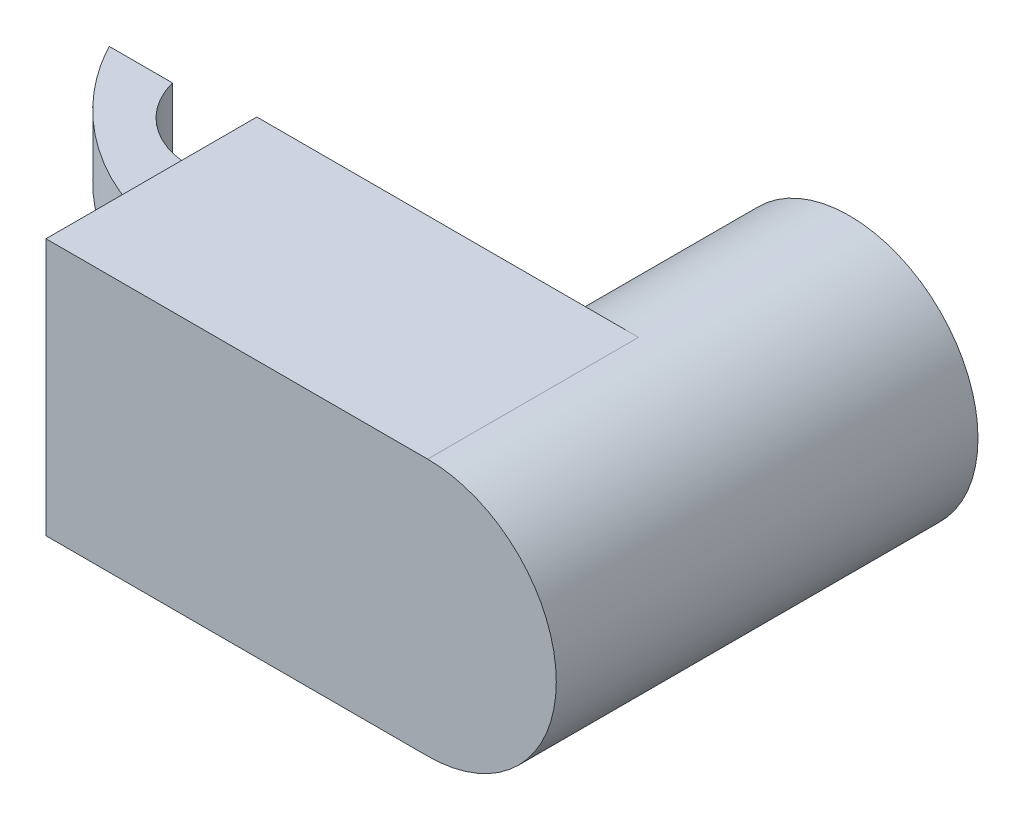
ISO-10303-21;
HEADER;
FILE_DESCRIPTION(('STEP AP214'),'2;1');
FILE_NAME('part.step','',(''),(''),'','','');
FILE_SCHEMA(('AUTOMOTIVE_DESIGN { 1 0 10303 214 1 1 1 1 }'));
ENDSEC;
DATA;
#1=APPLICATION_CONTEXT('core data for automotive mechanical design processes');
#2=APPLICATION_PROTOCOL_DEFINITION('international standard','automotive_design',2000,#1);
#3=PRODUCT_CONTEXT('',#1,'mechanical');
#4=PRODUCT('Part','Part','',(#3));
#5=PRODUCT_RELATED_PRODUCT_CATEGORY('part','',(#4));
#6=PRODUCT_DEFINITION_FORMATION('','',#4);
#7=PRODUCT_DEFINITION_CONTEXT('part definition',#1,'design');
#8=PRODUCT_DEFINITION('design','',#6,#7);
#9=PRODUCT_DEFINITION_SHAPE('','',#8);
#10=(LENGTH_UNIT() NAMED_UNIT(*) SI_UNIT(.MILLI.,.METRE.));
#11=(NAMED_UNIT(*) PLANE_ANGLE_UNIT() SI_UNIT($,.RADIAN.));
#12=(NAMED_UNIT(*) SI_UNIT($,.STERADIAN.) SOLID_ANGLE_UNIT());
#13=UNCERTAINTY_MEASURE_WITH_UNIT(LENGTH_MEASURE(1.E-05),#10,'distance_accuracy_value','');
#14=(GEOMETRIC_REPRESENTATION_CONTEXT(3) GLOBAL_UNCERTAINTY_ASSIGNED_CONTEXT((#13)) GLOBAL_UNIT_ASSIGNED_CONTEXT((#10,
#11,#12)) REPRESENTATION_CONTEXT('',''));
#15=CARTESIAN_POINT('',(0.,0.,0.));
#16=DIRECTION('',(0.,0.,1.));
#17=DIRECTION('',(1.,0.,0.));
#18=AXIS2_PLACEMENT_3D('',#15,#16,#17);
#19=CARTESIAN_POINT('',(0.,0.,100.));
#20=DIRECTION('',(0.,0.,-1.));
#21=DIRECTION('',(-1.,0.,0.));
#22=AXIS2_PLACEMENT_3D('',#19,#20,#21);
#23=CYLINDRICAL_SURFACE('',#22,30.5);
#24=CARTESIAN_POINT('',(0.,0.,0.));
#25=DIRECTION('',(0.,0.,1.));
#26=DIRECTION('',(1.,0.,0.));
#27=AXIS2_PLACEMENT_3D('',#24,#25,#26);
#28=CIRCLE('',#27,30.5);
#29=CARTESIAN_POINT('',(30.5,0.,0.));
#30=VERTEX_POINT('',#29);
#31=EDGE_CURVE('E167',#30,#30,#28,.T.);
#32=ORIENTED_EDGE('',*,*,#31,.T.);
#33=EDGE_LOOP('',(#32));
#34=FACE_BOUND('',#33,.T.);
#35=DIRECTION('',(0.,0.,-1.));
#36=VECTOR('',#35,1.);
#37=CARTESIAN_POINT('',(0.,30.5,100.));
#38=LINE('',#37,#36);
#39=CARTESIAN_POINT('',(0.,30.5,50.));
#40=VERTEX_POINT('',#39);
#41=CARTESIAN_POINT('',(0.,30.5,100.));
#42=VERTEX_POINT('',#41);
#43=EDGE_CURVE('E497',#40,#42,#38,.F.);
#44=ORIENTED_EDGE('',*,*,#43,.T.);
#45=CARTESIAN_POINT('',(0.,0.,100.));
#46=DIRECTION('',(0.,0.,1.));
#47=DIRECTION('',(1.,0.,0.));
#48=AXIS2_PLACEMENT_3D('',#45,#46,#47);
#49=CIRCLE('',#48,30.5);
#50=CARTESIAN_POINT('',(0.,-30.5,100.));
#51=VERTEX_POINT('',#50);
#52=EDGE_CURVE('E13',#51,#42,#49,.T.);
#53=ORIENTED_EDGE('',*,*,#52,.F.);
#54=DIRECTION('',(0.,0.,-1.));
#55=VECTOR('',#54,1.);
#56=CARTESIAN_POINT('',(0.,-30.5,100.));
#57=LINE('',#56,#55);
#58=CARTESIAN_POINT('',(0.,-30.5,50.));
#59=VERTEX_POINT('',#58);
#60=EDGE_CURVE('E609',#59,#51,#57,.F.);
#61=ORIENTED_EDGE('',*,*,#60,.F.);
#62=CARTESIAN_POINT('',(0.,0.,50.));
#63=DIRECTION('',(0.,0.,-1.));
#64=DIRECTION('',(0.,1.,0.));
#65=AXIS2_PLACEMENT_3D('',#62,#63,#64);
#66=CIRCLE('',#65,30.5);
#67=EDGE_CURVE('E613',#40,#59,#66,.F.);
#68=ORIENTED_EDGE('',*,*,#67,.F.);
#69=EDGE_LOOP('',(#44,#53,#61,#68));
#70=FACE_BOUND('',#69,.T.);
#71=ADVANCED_FACE('F157',(#34,#70),#23,.T.);
#72=CARTESIAN_POINT('',(0.,0.,100.));
#73=DIRECTION('',(0.,0.,1.));
#74=DIRECTION('',(1.,0.,0.));
#75=AXIS2_PLACEMENT_3D('',#72,#73,#74);
#76=PLANE('',#75);
#77=ORIENTED_EDGE('',*,*,#52,.T.);
#78=DIRECTION('',(1.,0.,0.));
#79=VECTOR('',#78,1.);
#80=CARTESIAN_POINT('',(-90.5,30.5,100.));
#81=LINE('',#80,#79);
#82=CARTESIAN_POINT('',(-90.5,30.5,100.));
#83=VERTEX_POINT('',#82);
#84=EDGE_CURVE('E563',#83,#42,#81,.T.);
#85=ORIENTED_EDGE('',*,*,#84,.F.);
#86=DIRECTION('',(0.,1.,0.));
#87=VECTOR('',#86,1.);
#88=CARTESIAN_POINT('',(-90.5,30.5,100.));
#89=LINE('',#88,#87);
#90=CARTESIAN_POINT('',(-90.5,-30.5,100.));
#91=VERTEX_POINT('',#90);
#92=EDGE_CURVE('E605',#91,#83,#89,.T.);
#93=ORIENTED_EDGE('',*,*,#92,.F.);
#94=DIRECTION('',(1.,0.,0.));
#95=VECTOR('',#94,1.);
#96=CARTESIAN_POINT('',(-90.5,-30.5,100.));
#97=LINE('',#96,#95);
#98=EDGE_CURVE('E589',#91,#51,#97,.T.);
#99=ORIENTED_EDGE('',*,*,#98,.T.);
#100=EDGE_LOOP('',(#77,#85,#93,#99));
#101=FACE_BOUND('',#100,.T.);
#102=ADVANCED_FACE('F676',(#101),#76,.T.);
#103=CARTESIAN_POINT('',(0.,0.,0.));
#104=DIRECTION('',(0.,0.,1.));
#105=DIRECTION('',(1.,0.,0.));
#106=AXIS2_PLACEMENT_3D('',#103,#104,#105);
#107=PLANE('',#106);
#108=CARTESIAN_POINT('',(-17.68,-17.68,0.));
#109=DIRECTION('',(0.,0.,1.));
#110=DIRECTION('',(1.,0.,0.));
#111=AXIS2_PLACEMENT_3D('',#108,#109,#110);
#112=CIRCLE('',#111,2.5);
#113=CARTESIAN_POINT('',(-15.18,-17.68,0.));
#114=VERTEX_POINT('',#113);
#115=EDGE_CURVE('E559',#114,#114,#112,.F.);
#116=ORIENTED_EDGE('',*,*,#115,.F.);
#117=EDGE_LOOP('',(#116));
#118=FACE_BOUND('',#117,.T.);
#119=CARTESIAN_POINT('',(-17.68,17.68,0.));
#120=DIRECTION('',(0.,0.,1.));
#121=DIRECTION('',(1.,0.,0.));
#122=AXIS2_PLACEMENT_3D('',#119,#120,#121);
#123=CIRCLE('',#122,2.5);
#124=CARTESIAN_POINT('',(-15.18,17.68,0.));
#125=VERTEX_POINT('',#124);
#126=EDGE_CURVE('E558',#125,#125,#123,.F.);
#127=ORIENTED_EDGE('',*,*,#126,.F.);
#128=EDGE_LOOP('',(#127));
#129=FACE_BOUND('',#128,.T.);
#130=CARTESIAN_POINT('',(17.68,17.68,0.));
#131=DIRECTION('',(0.,0.,1.));
#132=DIRECTION('',(1.,0.,0.));
#133=AXIS2_PLACEMENT_3D('',#130,#131,#132);
#134=CIRCLE('',#133,2.5);
#135=CARTESIAN_POINT('',(20.18,17.68,0.));
#136=VERTEX_POINT('',#135);
#137=EDGE_CURVE('E568',#136,#136,#134,.F.);
#138=ORIENTED_EDGE('',*,*,#137,.F.);
#139=EDGE_LOOP('',(#138));
#140=FACE_BOUND('',#139,.T.);
#141=CARTESIAN_POINT('',(17.68,-17.68,0.));
#142=DIRECTION('',(0.,0.,1.));
#143=DIRECTION('',(1.,0.,0.));
#144=AXIS2_PLACEMENT_3D('',#141,#142,#143);
#145=CIRCLE('',#144,2.5);
#146=CARTESIAN_POINT('',(20.18,-17.68,0.));
#147=VERTEX_POINT('',#146);
#148=EDGE_CURVE('E544',#147,#147,#145,.F.);
#149=ORIENTED_EDGE('',*,*,#148,.F.);
#150=EDGE_LOOP('',(#149));
#151=FACE_BOUND('',#150,.T.);
#152=ORIENTED_EDGE('',*,*,#31,.F.);
#153=EDGE_LOOP('',(#152));
#154=FACE_BOUND('',#153,.T.);
#155=ADVANCED_FACE('F674',(#118,#129,#140,#151,#154),#107,.F.);
#156=CARTESIAN_POINT('',(17.68,-17.68,-0.001000000000001));
#157=DIRECTION('',(0.,0.,1.));
#158=DIRECTION('',(1.,0.,0.));
#159=AXIS2_PLACEMENT_3D('',#156,#157,#158);
#160=CYLINDRICAL_SURFACE('',#159,2.5);
#161=CARTESIAN_POINT('',(17.68,-17.68,50.));
#162=DIRECTION('',(0.,0.,1.));
#163=DIRECTION('',(1.,0.,0.));
#164=AXIS2_PLACEMENT_3D('',#161,#162,#163);
#165=CIRCLE('',#164,2.5);
#166=CARTESIAN_POINT('',(20.18,-17.68,50.));
#167=VERTEX_POINT('',#166);
#168=EDGE_CURVE('E549',#167,#167,#165,.T.);
#169=ORIENTED_EDGE('',*,*,#168,.T.);
#170=EDGE_LOOP('',(#169));
#171=FACE_BOUND('',#170,.T.);
#172=ORIENTED_EDGE('',*,*,#148,.T.);
#173=EDGE_LOOP('',(#172));
#174=FACE_BOUND('',#173,.T.);
#175=ADVANCED_FACE('F670',(#171,#174),#160,.F.);
#176=CARTESIAN_POINT('',(17.68,-17.68,50.));
#177=DIRECTION('',(0.,0.,1.));
#178=DIRECTION('',(1.,0.,0.));
#179=AXIS2_PLACEMENT_3D('',#176,#177,#178);
#180=PLANE('',#179);
#181=ORIENTED_EDGE('',*,*,#168,.F.);
#182=EDGE_LOOP('',(#181));
#183=FACE_BOUND('',#182,.T.);
#184=ADVANCED_FACE('F648',(#183),#180,.F.);
#185=CARTESIAN_POINT('',(17.68,17.68,-0.001000000000001));
#186=DIRECTION('',(0.,0.,1.));
#187=DIRECTION('',(1.,0.,0.));
#188=AXIS2_PLACEMENT_3D('',#185,#186,#187);
#189=CYLINDRICAL_SURFACE('',#188,2.5);
#190=CARTESIAN_POINT('',(17.68,17.68,50.));
#191=DIRECTION('',(0.,0.,1.));
#192=DIRECTION('',(1.,0.,0.));
#193=AXIS2_PLACEMENT_3D('',#190,#191,#192);
#194=CIRCLE('',#193,2.5);
#195=CARTESIAN_POINT('',(20.18,17.68,50.));
#196=VERTEX_POINT('',#195);
#197=EDGE_CURVE('E553',#196,#196,#194,.T.);
#198=ORIENTED_EDGE('',*,*,#197,.T.);
#199=EDGE_LOOP('',(#198));
#200=FACE_BOUND('',#199,.T.);
#201=ORIENTED_EDGE('',*,*,#137,.T.);
#202=EDGE_LOOP('',(#201));
#203=FACE_BOUND('',#202,.T.);
#204=ADVANCED_FACE('F644',(#200,#203),#189,.F.);
#205=CARTESIAN_POINT('',(17.68,17.68,50.));
#206=DIRECTION('',(0.,0.,1.));
#207=DIRECTION('',(1.,0.,0.));
#208=AXIS2_PLACEMENT_3D('',#205,#206,#207);
#209=PLANE('',#208);
#210=ORIENTED_EDGE('',*,*,#197,.F.);
#211=EDGE_LOOP('',(#210));
#212=FACE_BOUND('',#211,.T.);
#213=ADVANCED_FACE('F647',(#212),#209,.F.);
#214=CARTESIAN_POINT('',(-17.68,17.68,-0.001000000000001));
#215=DIRECTION('',(0.,0.,1.));
#216=DIRECTION('',(1.,0.,0.));
#217=AXIS2_PLACEMENT_3D('',#214,#215,#216);
#218=CYLINDRICAL_SURFACE('',#217,2.5);
#219=CARTESIAN_POINT('',(-17.68,17.68,50.));
#220=DIRECTION('',(0.,0.,1.));
#221=DIRECTION('',(1.,0.,0.));
#222=AXIS2_PLACEMENT_3D('',#219,#220,#221);
#223=CIRCLE('',#222,2.5);
#224=CARTESIAN_POINT('',(-15.18,17.68,50.));
#225=VERTEX_POINT('',#224);
#226=EDGE_CURVE('E564',#225,#225,#223,.T.);
#227=ORIENTED_EDGE('',*,*,#226,.T.);
#228=EDGE_LOOP('',(#227));
#229=FACE_BOUND('',#228,.T.);
#230=ORIENTED_EDGE('',*,*,#126,.T.);
#231=EDGE_LOOP('',(#230));
#232=FACE_BOUND('',#231,.T.);
#233=ADVANCED_FACE('F652',(#229,#232),#218,.F.);
#234=CARTESIAN_POINT('',(-17.68,17.68,50.));
#235=DIRECTION('',(0.,0.,1.));
#236=DIRECTION('',(1.,0.,0.));
#237=AXIS2_PLACEMENT_3D('',#234,#235,#236);
#238=PLANE('',#237);
#239=ORIENTED_EDGE('',*,*,#226,.F.);
#240=EDGE_LOOP('',(#239));
#241=FACE_BOUND('',#240,.T.);
#242=ADVANCED_FACE('F656',(#241),#238,.F.);
#243=CARTESIAN_POINT('',(-17.68,-17.68,-0.001000000000001));
#244=DIRECTION('',(0.,0.,1.));
#245=DIRECTION('',(1.,0.,0.));
#246=AXIS2_PLACEMENT_3D('',#243,#244,#245);
#247=CYLINDRICAL_SURFACE('',#246,2.5);
#248=CARTESIAN_POINT('',(-17.68,-17.68,50.));
#249=DIRECTION('',(0.,0.,1.));
#250=DIRECTION('',(1.,0.,0.));
#251=AXIS2_PLACEMENT_3D('',#248,#249,#250);
#252=CIRCLE('',#251,2.5);
#253=CARTESIAN_POINT('',(-15.18,-17.68,50.));
#254=VERTEX_POINT('',#253);
#255=EDGE_CURVE('E554',#254,#254,#252,.T.);
#256=ORIENTED_EDGE('',*,*,#255,.T.);
#257=EDGE_LOOP('',(#256));
#258=FACE_BOUND('',#257,.T.);
#259=ORIENTED_EDGE('',*,*,#115,.T.);
#260=EDGE_LOOP('',(#259));
#261=FACE_BOUND('',#260,.T.);
#262=ADVANCED_FACE('F660',(#258,#261),#247,.F.);
#263=CARTESIAN_POINT('',(-17.68,-17.68,50.));
#264=DIRECTION('',(0.,0.,1.));
#265=DIRECTION('',(1.,0.,0.));
#266=AXIS2_PLACEMENT_3D('',#263,#264,#265);
#267=PLANE('',#266);
#268=ORIENTED_EDGE('',*,*,#255,.F.);
#269=EDGE_LOOP('',(#268));
#270=FACE_BOUND('',#269,.T.);
#271=ADVANCED_FACE('F642',(#270),#267,.F.);
#272=CARTESIAN_POINT('',(-90.5,30.5,100.));
#273=DIRECTION('',(0.,-1.,0.));
#274=DIRECTION('',(0.,0.,-1.));
#275=AXIS2_PLACEMENT_3D('',#272,#273,#274);
#276=PLANE('',#275);
#277=ORIENTED_EDGE('',*,*,#84,.T.);
#278=ORIENTED_EDGE('',*,*,#43,.F.);
#279=DIRECTION('',(1.,0.,0.));
#280=VECTOR('',#279,1.);
#281=CARTESIAN_POINT('',(-90.5,30.5,50.));
#282=LINE('',#281,#280);
#283=CARTESIAN_POINT('',(-90.5,30.5,50.));
#284=VERTEX_POINT('',#283);
#285=EDGE_CURVE('E581',#284,#40,#282,.T.);
#286=ORIENTED_EDGE('',*,*,#285,.F.);
#287=DIRECTION('',(0.,0.,-1.));
#288=VECTOR('',#287,1.);
#289=CARTESIAN_POINT('',(-90.5,30.5,100.));
#290=LINE('',#289,#288);
#291=EDGE_CURVE('E601',#83,#284,#290,.T.);
#292=ORIENTED_EDGE('',*,*,#291,.F.);
#293=EDGE_LOOP('',(#277,#278,#286,#292));
#294=FACE_BOUND('',#293,.T.);
#295=ADVANCED_FACE('F638',(#294),#276,.F.);
#296=CARTESIAN_POINT('',(-90.5,30.5,50.));
#297=DIRECTION('',(0.,0.,1.));
#298=DIRECTION('',(0.,-1.,0.));
#299=AXIS2_PLACEMENT_3D('',#296,#297,#298);
#300=PLANE('',#299);
#301=ORIENTED_EDGE('',*,*,#285,.T.);
#302=ORIENTED_EDGE('',*,*,#67,.T.);
#303=DIRECTION('',(1.,0.,0.));
#304=VECTOR('',#303,1.);
#305=CARTESIAN_POINT('',(-90.5,-30.5,50.));
#306=LINE('',#305,#304);
#307=CARTESIAN_POINT('',(-90.5,-30.5,50.));
#308=VERTEX_POINT('',#307);
#309=EDGE_CURVE('E585',#308,#59,#306,.T.);
#310=ORIENTED_EDGE('',*,*,#309,.F.);
#311=DIRECTION('',(0.,-1.,0.));
#312=VECTOR('',#311,1.);
#313=CARTESIAN_POINT('',(-90.5,30.5,50.));
#314=LINE('',#313,#312);
#315=EDGE_CURVE('E597',#284,#308,#314,.T.);
#316=ORIENTED_EDGE('',*,*,#315,.F.);
#317=EDGE_LOOP('',(#301,#302,#310,#316));
#318=FACE_BOUND('',#317,.T.);
#319=ADVANCED_FACE('F634',(#318),#300,.F.);
#320=CARTESIAN_POINT('',(-90.5,-30.5,100.));
#321=DIRECTION('',(0.,1.,0.));
#322=DIRECTION('',(0.,0.,1.));
#323=AXIS2_PLACEMENT_3D('',#320,#321,#322);
#324=PLANE('',#323);
#325=ORIENTED_EDGE('',*,*,#309,.T.);
#326=ORIENTED_EDGE('',*,*,#60,.T.);
#327=ORIENTED_EDGE('',*,*,#98,.F.);
#328=DIRECTION('',(0.,0.,1.));
#329=VECTOR('',#328,1.);
#330=CARTESIAN_POINT('',(-90.5,-30.5,100.));
#331=LINE('',#330,#329);
#332=EDGE_CURVE('E593',#308,#91,#331,.T.);
#333=ORIENTED_EDGE('',*,*,#332,.F.);
#334=EDGE_LOOP('',(#325,#326,#327,#333));
#335=FACE_BOUND('',#334,.T.);
#336=ADVANCED_FACE('F631',(#335),#324,.F.);
#337=CARTESIAN_POINT('',(-90.5,0.,0.));
#338=DIRECTION('',(1.,0.,0.));
#339=DIRECTION('',(0.,0.,-1.));
#340=AXIS2_PLACEMENT_3D('',#337,#338,#339);
#341=PLANE('',#340);
#342=DIRECTION('',(0.,1.,0.));
#343=VECTOR('',#342,1.);
#344=CARTESIAN_POINT('',(-90.5,0.,80.));
#345=LINE('',#344,#343);
#346=CARTESIAN_POINT('',(-90.5,-12.5,80.));
#347=VERTEX_POINT('',#346);
#348=CARTESIAN_POINT('',(-90.5,-27.5,80.));
#349=VERTEX_POINT('',#348);
#350=EDGE_CURVE('E221',#347,#349,#345,.F.);
#351=ORIENTED_EDGE('',*,*,#350,.T.);
#352=DIRECTION('',(0.,0.,-1.));
#353=VECTOR('',#352,1.);
#354=CARTESIAN_POINT('',(-90.5,-27.5,0.));
#355=LINE('',#354,#353);
#356=CARTESIAN_POINT('',(-90.5,-27.5,65.));
#357=VERTEX_POINT('',#356);
#358=EDGE_CURVE('E160',#349,#357,#355,.T.);
#359=ORIENTED_EDGE('',*,*,#358,.T.);
#360=DIRECTION('',(0.,1.,0.));
#361=VECTOR('',#360,1.);
#362=CARTESIAN_POINT('',(-90.5,0.,65.));
#363=LINE('',#362,#361);
#364=CARTESIAN_POINT('',(-90.5,-12.5,65.));
#365=VERTEX_POINT('',#364);
#366=EDGE_CURVE('E213',#357,#365,#363,.T.);
#367=ORIENTED_EDGE('',*,*,#366,.T.);
#368=DIRECTION('',(0.,0.,-1.));
#369=VECTOR('',#368,1.);
#370=CARTESIAN_POINT('',(-90.5,-12.5,0.));
#371=LINE('',#370,#369);
#372=EDGE_CURVE('E176',#365,#347,#371,.F.);
#373=ORIENTED_EDGE('',*,*,#372,.T.);
#374=EDGE_LOOP('',(#351,#359,#367,#373));
#375=FACE_BOUND('',#374,.T.);
#376=DIRECTION('',(0.,0.,-1.));
#377=VECTOR('',#376,1.);
#378=CARTESIAN_POINT('',(-90.5,27.5,80.));
#379=LINE('',#378,#377);
#380=CARTESIAN_POINT('',(-90.5,27.5,80.));
#381=VERTEX_POINT('',#380);
#382=CARTESIAN_POINT('',(-90.5,27.5,65.));
#383=VERTEX_POINT('',#382);
#384=EDGE_CURVE('E392',#381,#383,#379,.T.);
#385=ORIENTED_EDGE('',*,*,#384,.F.);
#386=DIRECTION('',(0.,1.,0.));
#387=VECTOR('',#386,1.);
#388=CARTESIAN_POINT('',(-90.5,27.5,80.));
#389=LINE('',#388,#387);
#390=CARTESIAN_POINT('',(-90.5,12.5,80.));
#391=VERTEX_POINT('',#390);
#392=EDGE_CURVE('E525',#391,#381,#389,.T.);
#393=ORIENTED_EDGE('',*,*,#392,.F.);
#394=DIRECTION('',(0.,0.,1.));
#395=VECTOR('',#394,1.);
#396=CARTESIAN_POINT('',(-90.5,12.5,80.));
#397=LINE('',#396,#395);
#398=CARTESIAN_POINT('',(-90.5,12.5,65.));
#399=VERTEX_POINT('',#398);
#400=EDGE_CURVE('E520',#399,#391,#397,.T.);
#401=ORIENTED_EDGE('',*,*,#400,.F.);
#402=DIRECTION('',(0.,-1.,0.));
#403=VECTOR('',#402,1.);
#404=CARTESIAN_POINT('',(-90.5,27.5,65.));
#405=LINE('',#404,#403);
#406=EDGE_CURVE('E512',#383,#399,#405,.T.);
#407=ORIENTED_EDGE('',*,*,#406,.F.);
#408=EDGE_LOOP('',(#385,#393,#401,#407));
#409=FACE_BOUND('',#408,.T.);
#410=ORIENTED_EDGE('',*,*,#92,.T.);
#411=ORIENTED_EDGE('',*,*,#291,.T.);
#412=ORIENTED_EDGE('',*,*,#315,.T.);
#413=ORIENTED_EDGE('',*,*,#332,.T.);
#414=EDGE_LOOP('',(#410,#411,#412,#413));
#415=FACE_BOUND('',#414,.T.);
#416=ADVANCED_FACE('F219',(#375,#409,#415),#341,.F.);
#417=CARTESIAN_POINT('',(0.,0.,50.));
#418=DIRECTION('',(0.,0.,1.));
#419=DIRECTION('',(1.,0.,0.));
#420=AXIS2_PLACEMENT_3D('',#417,#418,#419);
#421=PLANE('',#420);
#422=DIRECTION('',(0.,1.,0.));
#423=VECTOR('',#422,1.);
#424=CARTESIAN_POINT('',(-125.5,27.5,50.));
#425=LINE('',#424,#423);
#426=CARTESIAN_POINT('',(-125.5,12.5,50.));
#427=VERTEX_POINT('',#426);
#428=CARTESIAN_POINT('',(-125.5,27.5,50.));
#429=VERTEX_POINT('',#428);
#430=EDGE_CURVE('E380',#427,#429,#425,.T.);
#431=ORIENTED_EDGE('',*,*,#430,.T.);
#432=DIRECTION('',(1.,0.,0.));
#433=VECTOR('',#432,1.);
#434=CARTESIAN_POINT('',(-125.5,27.5,50.));
#435=LINE('',#434,#433);
#436=CARTESIAN_POINT('',(-110.5,27.5,50.));
#437=VERTEX_POINT('',#436);
#438=EDGE_CURVE('E492',#429,#437,#435,.T.);
#439=ORIENTED_EDGE('',*,*,#438,.T.);
#440=DIRECTION('',(0.,-1.,0.));
#441=VECTOR('',#440,1.);
#442=CARTESIAN_POINT('',(-110.5,27.5,50.));
#443=LINE('',#442,#441);
#444=CARTESIAN_POINT('',(-110.5,12.5,50.));
#445=VERTEX_POINT('',#444);
#446=EDGE_CURVE('E416',#437,#445,#443,.T.);
#447=ORIENTED_EDGE('',*,*,#446,.T.);
#448=DIRECTION('',(-1.,0.,0.));
#449=VECTOR('',#448,1.);
#450=CARTESIAN_POINT('',(-125.5,12.5,50.));
#451=LINE('',#450,#449);
#452=EDGE_CURVE('E482',#445,#427,#451,.T.);
#453=ORIENTED_EDGE('',*,*,#452,.T.);
#454=EDGE_LOOP('',(#431,#439,#447,#453));
#455=FACE_BOUND('',#454,.T.);
#456=ADVANCED_FACE('F449',(#455),#421,.F.);
#457=CARTESIAN_POINT('',(-90.5,27.5,80.));
#458=DIRECTION('',(0.,1.,0.));
#459=DIRECTION('',(0.,0.,-1.));
#460=AXIS2_PLACEMENT_3D('',#457,#458,#459);
#461=PLANE('',#460);
#462=ORIENTED_EDGE('',*,*,#384,.T.);
#463=CARTESIAN_POINT('',(-90.5,27.5,65.));
#464=CARTESIAN_POINT('',(-99.8518917468118,27.5,65.2959029911236));
#465=CARTESIAN_POINT('',(-108.165537182371,27.5,59.0606689144539));
#466=CARTESIAN_POINT('',(-110.5,27.5,50.));
#467=B_SPLINE_CURVE_WITH_KNOTS('',3,(#463,#464,#465,#466),.UNSPECIFIED.,.F.,.F.,(4,4),(0.,1.),.UNSPECIFIED.);
#468=EDGE_CURVE('E368',#383,#437,#467,.T.);
#469=ORIENTED_EDGE('',*,*,#468,.T.);
#470=ORIENTED_EDGE('',*,*,#438,.F.);
#471=CARTESIAN_POINT('',(-90.5,27.5,80.));
#472=CARTESIAN_POINT('',(-104.851891746812,27.5,75.2959029911236));
#473=CARTESIAN_POINT('',(-118.165537182371,27.5,64.0606689144539));
#474=CARTESIAN_POINT('',(-125.5,27.5,50.));
#475=B_SPLINE_CURVE_WITH_KNOTS('',3,(#471,#472,#473,#474),.UNSPECIFIED.,.F.,.F.,(4,4),(0.,1.),.UNSPECIFIED.);
#476=EDGE_CURVE('E359',#381,#429,#475,.T.);
#477=ORIENTED_EDGE('',*,*,#476,.F.);
#478=EDGE_LOOP('',(#462,#469,#470,#477));
#479=FACE_BOUND('',#478,.T.);
#480=ADVANCED_FACE('F448',(#479),#461,.T.);
#481=CARTESIAN_POINT('',(-90.5,12.5,80.));
#482=CARTESIAN_POINT('',(-104.851891746812,12.5,75.2959029911236));
#483=CARTESIAN_POINT('',(-118.165537182371,12.5,64.0606689144539));
#484=CARTESIAN_POINT('',(-125.5,12.5,50.));
#485=CARTESIAN_POINT('',(-90.5,13.75,80.));
#486=CARTESIAN_POINT('',(-104.851891746812,13.75,75.2959029911236));
#487=CARTESIAN_POINT('',(-118.165537182371,13.75,64.0606689144539));
#488=CARTESIAN_POINT('',(-125.5,13.75,50.));
#489=CARTESIAN_POINT('',(-90.5000000000001,16.25,80.));
#490=CARTESIAN_POINT('',(-104.851891746812,16.25,75.2959029911236));
#491=CARTESIAN_POINT('',(-118.165537182371,16.25,64.060668914454));
#492=CARTESIAN_POINT('',(-125.5,16.25,50.));
#493=CARTESIAN_POINT('',(-90.4999999999999,20.,80.));
#494=CARTESIAN_POINT('',(-104.851891746812,20.,75.2959029911236));
#495=CARTESIAN_POINT('',(-118.165537182371,20.,64.0606689144539));
#496=CARTESIAN_POINT('',(-125.5,20.,50.));
#497=CARTESIAN_POINT('',(-90.5,23.75,80.));
#498=CARTESIAN_POINT('',(-104.851891746812,23.75,75.2959029911236));
#499=CARTESIAN_POINT('',(-118.165537182371,23.75,64.0606689144539));
#500=CARTESIAN_POINT('',(-125.5,23.75,50.));
#501=CARTESIAN_POINT('',(-90.5,26.25,80.));
#502=CARTESIAN_POINT('',(-104.851891746812,26.25,75.2959029911236));
#503=CARTESIAN_POINT('',(-118.165537182371,26.25,64.0606689144539));
#504=CARTESIAN_POINT('',(-125.5,26.25,50.));
#505=CARTESIAN_POINT('',(-90.5,27.5,80.));
#506=CARTESIAN_POINT('',(-104.851891746812,27.5,75.2959029911236));
#507=CARTESIAN_POINT('',(-118.165537182371,27.5,64.0606689144539));
#508=CARTESIAN_POINT('',(-125.5,27.5,50.));
#509=B_SPLINE_SURFACE_WITH_KNOTS('',3,3,((#481,#482,#483,#484),(#485,#486,#487,#488),(#489,#490,
#491,#492),(#493,#494,#495,#496),(#497,#498,#499,#500),(#501,#502,#503,#504),(#505,#506,#507,
#508)),.UNSPECIFIED.,.F.,.F.,.F.,(4,1,1,1,4),(4,4),(0.5,0.5625,0.625,0.6875,0.75),(0.,1.),.UNSPECIFIED.);
#510=CARTESIAN_POINT('',(-90.5,12.5,80.));
#511=CARTESIAN_POINT('',(-104.851891746812,12.5,75.2959029911236));
#512=CARTESIAN_POINT('',(-118.165537182371,12.5,64.0606689144539));
#513=CARTESIAN_POINT('',(-125.5,12.5,50.));
#514=B_SPLINE_CURVE_WITH_KNOTS('',3,(#510,#511,#512,#513),.UNSPECIFIED.,.F.,.F.,(4,4),(0.,1.),.UNSPECIFIED.);
#515=EDGE_CURVE('E369',#391,#427,#514,.T.);
#516=ORIENTED_EDGE('',*,*,#392,.T.);
#517=ORIENTED_EDGE('',*,*,#476,.T.);
#518=ORIENTED_EDGE('',*,*,#430,.F.);
#519=ORIENTED_EDGE('',*,*,#515,.F.);
#520=EDGE_LOOP('',(#516,#517,#518,#519));
#521=FACE_BOUND('',#520,.T.);
#522=ADVANCED_FACE('F436',(#521),#509,.T.);
#523=CARTESIAN_POINT('',(-90.5,12.5,65.));
#524=DIRECTION('',(0.,-1.,0.));
#525=DIRECTION('',(0.,0.,1.));
#526=AXIS2_PLACEMENT_3D('',#523,#524,#525);
#527=PLANE('',#526);
#528=ORIENTED_EDGE('',*,*,#400,.T.);
#529=ORIENTED_EDGE('',*,*,#515,.T.);
#530=ORIENTED_EDGE('',*,*,#452,.F.);
#531=CARTESIAN_POINT('',(-90.5,12.5,65.));
#532=CARTESIAN_POINT('',(-99.8518917468118,12.5,65.2959029911236));
#533=CARTESIAN_POINT('',(-108.165537182371,12.5,59.0606689144539));
#534=CARTESIAN_POINT('',(-110.5,12.5,50.));
#535=B_SPLINE_CURVE_WITH_KNOTS('',3,(#531,#532,#533,#534),.UNSPECIFIED.,.F.,.F.,(4,4),(0.,1.),.UNSPECIFIED.);
#536=EDGE_CURVE('E385',#399,#445,#535,.T.);
#537=ORIENTED_EDGE('',*,*,#536,.F.);
#538=EDGE_LOOP('',(#528,#529,#530,#537));
#539=FACE_BOUND('',#538,.T.);
#540=ADVANCED_FACE('F447',(#539),#527,.T.);
#541=CARTESIAN_POINT('',(-90.5,27.5,65.));
#542=CARTESIAN_POINT('',(-99.8518917468118,27.5,65.2959029911236));
#543=CARTESIAN_POINT('',(-108.165537182371,27.5,59.0606689144539));
#544=CARTESIAN_POINT('',(-110.5,27.5,50.));
#545=CARTESIAN_POINT('',(-90.5,26.25,65.));
#546=CARTESIAN_POINT('',(-99.8518917468118,26.25,65.2959029911236));
#547=CARTESIAN_POINT('',(-108.165537182371,26.25,59.0606689144539));
#548=CARTESIAN_POINT('',(-110.5,26.25,50.));
#549=CARTESIAN_POINT('',(-90.5,23.75,65.));
#550=CARTESIAN_POINT('',(-99.8518917468118,23.75,65.2959029911236));
#551=CARTESIAN_POINT('',(-108.165537182371,23.75,59.0606689144539));
#552=CARTESIAN_POINT('',(-110.5,23.75,50.));
#553=CARTESIAN_POINT('',(-90.5,20.,65.));
#554=CARTESIAN_POINT('',(-99.8518917468118,20.,65.2959029911236));
#555=CARTESIAN_POINT('',(-108.165537182371,20.,59.0606689144539));
#556=CARTESIAN_POINT('',(-110.5,20.,50.));
#557=CARTESIAN_POINT('',(-90.4999999999999,16.25,65.));
#558=CARTESIAN_POINT('',(-99.8518917468118,16.25,65.2959029911236));
#559=CARTESIAN_POINT('',(-108.165537182371,16.25,59.0606689144539));
#560=CARTESIAN_POINT('',(-110.5,16.25,50.));
#561=CARTESIAN_POINT('',(-90.5,13.75,65.));
#562=CARTESIAN_POINT('',(-99.8518917468118,13.75,65.2959029911236));
#563=CARTESIAN_POINT('',(-108.165537182371,13.75,59.0606689144539));
#564=CARTESIAN_POINT('',(-110.5,13.75,50.));
#565=CARTESIAN_POINT('',(-90.5,12.5,65.));
#566=CARTESIAN_POINT('',(-99.8518917468118,12.5,65.2959029911236));
#567=CARTESIAN_POINT('',(-108.165537182371,12.5,59.0606689144539));
#568=CARTESIAN_POINT('',(-110.5,12.5,50.));
#569=B_SPLINE_SURFACE_WITH_KNOTS('',3,3,((#541,#542,#543,#544),(#545,#546,#547,#548),(#549,#550,
#551,#552),(#553,#554,#555,#556),(#557,#558,#559,#560),(#561,#562,#563,#564),(#565,#566,#567,
#568)),.UNSPECIFIED.,.F.,.F.,.F.,(4,1,1,1,4),(4,4),(0.,0.0625,0.125,0.1875,0.25),(0.,1.),.UNSPECIFIED.);
#570=ORIENTED_EDGE('',*,*,#406,.T.);
#571=ORIENTED_EDGE('',*,*,#536,.T.);
#572=ORIENTED_EDGE('',*,*,#446,.F.);
#573=ORIENTED_EDGE('',*,*,#468,.F.);
#574=EDGE_LOOP('',(#570,#571,#572,#573));
#575=FACE_BOUND('',#574,.T.);
#576=ADVANCED_FACE('F351',(#575),#569,.T.);
#577=CARTESIAN_POINT('',(0.,0.,50.));
#578=DIRECTION('',(0.,0.,1.));
#579=DIRECTION('',(1.,0.,0.));
#580=AXIS2_PLACEMENT_3D('',#577,#578,#579);
#581=PLANE('',#580);
#582=CARTESIAN_POINT('',(-125.5,-12.5,50.));
#583=CARTESIAN_POINT('',(-125.5,-13.75,50.));
#584=CARTESIAN_POINT('',(-125.5,-16.25,50.));
#585=CARTESIAN_POINT('',(-125.5,-20.,50.));
#586=CARTESIAN_POINT('',(-125.5,-23.75,50.));
#587=CARTESIAN_POINT('',(-125.5,-26.25,50.));
#588=CARTESIAN_POINT('',(-125.5,-27.5,50.));
#589=B_SPLINE_CURVE_WITH_KNOTS('',3,(#582,#583,#584,#585,#586,#587,#588),.UNSPECIFIED.,.F.,.F.,
(4,1,1,1,4),(0.5,0.5625,0.625,0.6875,0.75),.UNSPECIFIED.);
#590=CARTESIAN_POINT('',(-125.5,-12.5,50.));
#591=VERTEX_POINT('',#590);
#592=CARTESIAN_POINT('',(-125.5,-27.5,50.));
#593=VERTEX_POINT('',#592);
#594=EDGE_CURVE('E210',#591,#593,#589,.T.);
#595=ORIENTED_EDGE('',*,*,#594,.F.);
#596=CARTESIAN_POINT('',(-110.5,-12.5,50.));
#597=DIRECTION('',(-1.,0.,0.));
#598=VECTOR('',#597,1.);
#599=LINE('',#596,#598);
#600=CARTESIAN_POINT('',(-110.5,-12.5,50.));
#601=VERTEX_POINT('',#600);
#602=EDGE_CURVE('E317',#601,#591,#599,.T.);
#603=ORIENTED_EDGE('',*,*,#602,.F.);
#604=CARTESIAN_POINT('',(-110.5,-27.5,50.));
#605=CARTESIAN_POINT('',(-110.5,-26.25,50.));
#606=CARTESIAN_POINT('',(-110.5,-23.75,50.));
#607=CARTESIAN_POINT('',(-110.5,-20.,50.));
#608=CARTESIAN_POINT('',(-110.5,-16.25,50.));
#609=CARTESIAN_POINT('',(-110.5,-13.75,50.));
#610=CARTESIAN_POINT('',(-110.5,-12.5,50.));
#611=B_SPLINE_CURVE_WITH_KNOTS('',3,(#604,#605,#606,#607,#608,#609,#610),.UNSPECIFIED.,.F.,.F.,
(4,1,1,1,4),(0.,0.0625,0.125,0.1875,0.25),.UNSPECIFIED.);
#612=CARTESIAN_POINT('',(-110.5,-27.5,50.));
#613=VERTEX_POINT('',#612);
#614=EDGE_CURVE('E251',#613,#601,#611,.T.);
#615=ORIENTED_EDGE('',*,*,#614,.F.);
#616=CARTESIAN_POINT('',(-125.5,-27.5,50.));
#617=DIRECTION('',(1.,0.,0.));
#618=VECTOR('',#617,1.);
#619=LINE('',#616,#618);
#620=EDGE_CURVE('E204',#593,#613,#619,.T.);
#621=ORIENTED_EDGE('',*,*,#620,.F.);
#622=EDGE_LOOP('',(#595,#603,#615,#621));
#623=FACE_BOUND('',#622,.T.);
#624=ADVANCED_FACE('F280',(#623),#581,.F.);
#625=CARTESIAN_POINT('',(-90.5,-27.5,80.));
#626=DIRECTION('',(0.,-1.,0.));
#627=DIRECTION('',(0.,0.,-1.));
#628=AXIS2_PLACEMENT_3D('',#625,#626,#627);
#629=PLANE('',#628);
#630=ORIENTED_EDGE('',*,*,#358,.F.);
#631=CARTESIAN_POINT('',(-90.5,-27.5,80.));
#632=CARTESIAN_POINT('',(-104.851891746812,-27.5,75.2959029911236));
#633=CARTESIAN_POINT('',(-118.165537182371,-27.5,64.0606689144539));
#634=CARTESIAN_POINT('',(-125.5,-27.5,50.));
#635=B_SPLINE_CURVE_WITH_KNOTS('',3,(#631,#632,#633,#634),.UNSPECIFIED.,.F.,.F.,(4,4),(0.,1.),.UNSPECIFIED.);
#636=EDGE_CURVE('E191',#349,#593,#635,.T.);
#637=ORIENTED_EDGE('',*,*,#636,.T.);
#638=ORIENTED_EDGE('',*,*,#620,.T.);
#639=CARTESIAN_POINT('',(-90.5,-27.5,65.));
#640=CARTESIAN_POINT('',(-99.8518917468118,-27.5,65.2959029911236));
#641=CARTESIAN_POINT('',(-108.165537182371,-27.5,59.0606689144539));
#642=CARTESIAN_POINT('',(-110.5,-27.5,50.));
#643=B_SPLINE_CURVE_WITH_KNOTS('',3,(#639,#640,#641,#642),.UNSPECIFIED.,.F.,.F.,(4,4),(0.,1.),.UNSPECIFIED.);
#644=EDGE_CURVE('E197',#357,#613,#643,.T.);
#645=ORIENTED_EDGE('',*,*,#644,.F.);
#646=EDGE_LOOP('',(#630,#637,#638,#645));
#647=FACE_BOUND('',#646,.T.);
#648=ADVANCED_FACE('F199',(#647),#629,.T.);
#649=CARTESIAN_POINT('',(-90.5,-12.5,80.));
#650=CARTESIAN_POINT('',(-104.851891746812,-12.5,75.2959029911236));
#651=CARTESIAN_POINT('',(-118.165537182371,-12.5,64.0606689144539));
#652=CARTESIAN_POINT('',(-125.5,-12.5,50.));
#653=CARTESIAN_POINT('',(-90.5,-13.75,80.));
#654=CARTESIAN_POINT('',(-104.851891746812,-13.75,75.2959029911236));
#655=CARTESIAN_POINT('',(-118.165537182371,-13.75,64.0606689144539));
#656=CARTESIAN_POINT('',(-125.5,-13.75,50.));
#657=CARTESIAN_POINT('',(-90.5000000000001,-16.25,80.));
#658=CARTESIAN_POINT('',(-104.851891746812,-16.25,75.2959029911236));
#659=CARTESIAN_POINT('',(-118.165537182371,-16.25,64.060668914454));
#660=CARTESIAN_POINT('',(-125.5,-16.25,50.));
#661=CARTESIAN_POINT('',(-90.4999999999999,-20.,80.));
#662=CARTESIAN_POINT('',(-104.851891746812,-20.,75.2959029911236));
#663=CARTESIAN_POINT('',(-118.165537182371,-20.,64.0606689144539));
#664=CARTESIAN_POINT('',(-125.5,-20.,50.));
#665=CARTESIAN_POINT('',(-90.5,-23.75,80.));
#666=CARTESIAN_POINT('',(-104.851891746812,-23.75,75.2959029911236));
#667=CARTESIAN_POINT('',(-118.165537182371,-23.75,64.0606689144539));
#668=CARTESIAN_POINT('',(-125.5,-23.75,50.));
#669=CARTESIAN_POINT('',(-90.5,-26.25,80.));
#670=CARTESIAN_POINT('',(-104.851891746812,-26.25,75.2959029911236));
#671=CARTESIAN_POINT('',(-118.165537182371,-26.25,64.0606689144539));
#672=CARTESIAN_POINT('',(-125.5,-26.25,50.));
#673=CARTESIAN_POINT('',(-90.5,-27.5,80.));
#674=CARTESIAN_POINT('',(-104.851891746812,-27.5,75.2959029911236));
#675=CARTESIAN_POINT('',(-118.165537182371,-27.5,64.0606689144539));
#676=CARTESIAN_POINT('',(-125.5,-27.5,50.));
#677=B_SPLINE_SURFACE_WITH_KNOTS('',3,3,((#649,#650,#651,#652),(#653,#654,#655,#656),(#657,#658,
#659,#660),(#661,#662,#663,#664),(#665,#666,#667,#668),(#669,#670,#671,#672),(#673,#674,#675,
#676)),.UNSPECIFIED.,.F.,.F.,.F.,(4,1,1,1,4),(4,4),(0.5,0.5625,0.625,0.6875,0.75),(0.,1.),.UNSPECIFIED.);
#678=CARTESIAN_POINT('',(-90.5,-12.5,80.));
#679=CARTESIAN_POINT('',(-104.851891746812,-12.5,75.2959029911236));
#680=CARTESIAN_POINT('',(-118.165537182371,-12.5,64.0606689144539));
#681=CARTESIAN_POINT('',(-125.5,-12.5,50.));
#682=B_SPLINE_CURVE_WITH_KNOTS('',3,(#678,#679,#680,#681),.UNSPECIFIED.,.F.,.F.,(4,4),(0.,1.),.UNSPECIFIED.);
#683=EDGE_CURVE('E224',#347,#591,#682,.T.);
#684=ORIENTED_EDGE('',*,*,#350,.F.);
#685=ORIENTED_EDGE('',*,*,#683,.T.);
#686=ORIENTED_EDGE('',*,*,#594,.T.);
#687=ORIENTED_EDGE('',*,*,#636,.F.);
#688=EDGE_LOOP('',(#684,#685,#686,#687));
#689=FACE_BOUND('',#688,.T.);
#690=ADVANCED_FACE('F269',(#689),#677,.F.);
#691=CARTESIAN_POINT('',(-90.5,-12.5,65.));
#692=DIRECTION('',(0.,1.,0.));
#693=DIRECTION('',(0.,0.,1.));
#694=AXIS2_PLACEMENT_3D('',#691,#692,#693);
#695=PLANE('',#694);
#696=ORIENTED_EDGE('',*,*,#372,.F.);
#697=CARTESIAN_POINT('',(-90.5,-12.5,65.));
#698=CARTESIAN_POINT('',(-99.8518917468118,-12.5,65.2959029911236));
#699=CARTESIAN_POINT('',(-108.165537182371,-12.5,59.0606689144539));
#700=CARTESIAN_POINT('',(-110.5,-12.5,50.));
#701=B_SPLINE_CURVE_WITH_KNOTS('',3,(#697,#698,#699,#700),.UNSPECIFIED.,.F.,.F.,(4,4),(0.,1.),.UNSPECIFIED.);
#702=EDGE_CURVE('E215',#365,#601,#701,.T.);
#703=ORIENTED_EDGE('',*,*,#702,.T.);
#704=ORIENTED_EDGE('',*,*,#602,.T.);
#705=ORIENTED_EDGE('',*,*,#683,.F.);
#706=EDGE_LOOP('',(#696,#703,#704,#705));
#707=FACE_BOUND('',#706,.T.);
#708=ADVANCED_FACE('F268',(#707),#695,.T.);
#709=CARTESIAN_POINT('',(-90.5,-27.5,65.));
#710=CARTESIAN_POINT('',(-99.8518917468118,-27.5,65.2959029911236));
#711=CARTESIAN_POINT('',(-108.165537182371,-27.5,59.0606689144539));
#712=CARTESIAN_POINT('',(-110.5,-27.5,50.));
#713=CARTESIAN_POINT('',(-90.5,-26.25,65.));
#714=CARTESIAN_POINT('',(-99.8518917468118,-26.25,65.2959029911236));
#715=CARTESIAN_POINT('',(-108.165537182371,-26.25,59.0606689144539));
#716=CARTESIAN_POINT('',(-110.5,-26.25,50.));
#717=CARTESIAN_POINT('',(-90.5,-23.75,65.));
#718=CARTESIAN_POINT('',(-99.8518917468118,-23.75,65.2959029911236));
#719=CARTESIAN_POINT('',(-108.165537182371,-23.75,59.0606689144539));
#720=CARTESIAN_POINT('',(-110.5,-23.75,50.));
#721=CARTESIAN_POINT('',(-90.5,-20.,65.));
#722=CARTESIAN_POINT('',(-99.8518917468118,-20.,65.2959029911236));
#723=CARTESIAN_POINT('',(-108.165537182371,-20.,59.0606689144539));
#724=CARTESIAN_POINT('',(-110.5,-20.,50.));
#725=CARTESIAN_POINT('',(-90.4999999999999,-16.25,65.));
#726=CARTESIAN_POINT('',(-99.8518917468118,-16.25,65.2959029911236));
#727=CARTESIAN_POINT('',(-108.165537182371,-16.25,59.0606689144539));
#728=CARTESIAN_POINT('',(-110.5,-16.25,50.));
#729=CARTESIAN_POINT('',(-90.5,-13.75,65.));
#730=CARTESIAN_POINT('',(-99.8518917468118,-13.75,65.2959029911236));
#731=CARTESIAN_POINT('',(-108.165537182371,-13.75,59.0606689144539));
#732=CARTESIAN_POINT('',(-110.5,-13.75,50.));
#733=CARTESIAN_POINT('',(-90.5,-12.5,65.));
#734=CARTESIAN_POINT('',(-99.8518917468118,-12.5,65.2959029911236));
#735=CARTESIAN_POINT('',(-108.165537182371,-12.5,59.0606689144539));
#736=CARTESIAN_POINT('',(-110.5,-12.5,50.));
#737=B_SPLINE_SURFACE_WITH_KNOTS('',3,3,((#709,#710,#711,#712),(#713,#714,#715,#716),(#717,#718,
#719,#720),(#721,#722,#723,#724),(#725,#726,#727,#728),(#729,#730,#731,#732),(#733,#734,#735,
#736)),.UNSPECIFIED.,.F.,.F.,.F.,(4,1,1,1,4),(4,4),(0.,0.0625,0.125,0.1875,0.25),(0.,1.),.UNSPECIFIED.);
#738=ORIENTED_EDGE('',*,*,#366,.F.);
#739=ORIENTED_EDGE('',*,*,#644,.T.);
#740=ORIENTED_EDGE('',*,*,#614,.T.);
#741=ORIENTED_EDGE('',*,*,#702,.F.);
#742=EDGE_LOOP('',(#738,#739,#740,#741));
#743=FACE_BOUND('',#742,.T.);
#744=ADVANCED_FACE('F214',(#743),#737,.F.);
#745=CLOSED_SHELL('',(#71,#102,#155,#175,#184,#204,#213,#233,#242,#262,#271,#295,#319,#336,#416,
#456,#480,#522,#540,#576,#624,#648,#690,#708,#744));
#746=MANIFOLD_SOLID_BREP('B2',#745);
#747=ADVANCED_BREP_SHAPE_REPRESENTATION('',(#18,#746),#14);
#748=SHAPE_DEFINITION_REPRESENTATION(#9,#747);
ENDSEC;
END-ISO-10303-21;
